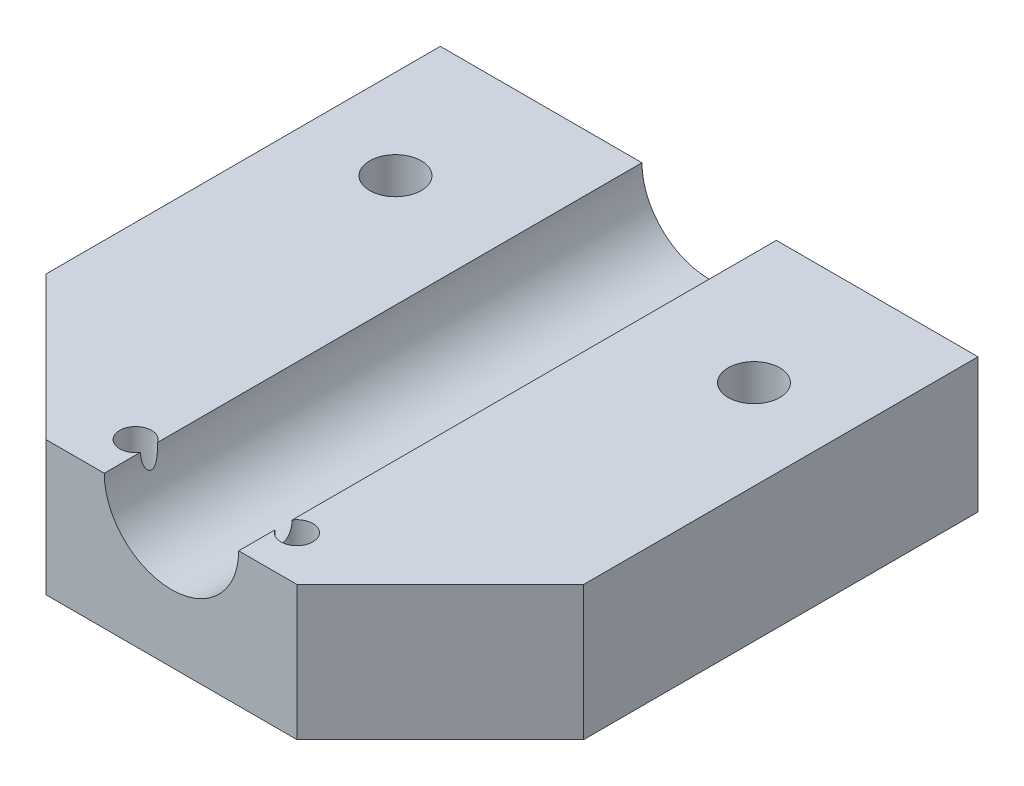
ISO-10303-21;
HEADER;
FILE_DESCRIPTION(('STEP AP214'),'2;1');
FILE_NAME('part.step','',(''),(''),'','','');
FILE_SCHEMA(('AUTOMOTIVE_DESIGN { 1 0 10303 214 1 1 1 1 }'));
ENDSEC;
DATA;
#1=APPLICATION_CONTEXT('core data for automotive mechanical design processes');
#2=APPLICATION_PROTOCOL_DEFINITION('international standard','automotive_design',2000,#1);
#3=PRODUCT_CONTEXT('',#1,'mechanical');
#4=PRODUCT('Part','Part','',(#3));
#5=PRODUCT_RELATED_PRODUCT_CATEGORY('part','',(#4));
#6=PRODUCT_DEFINITION_FORMATION('','',#4);
#7=PRODUCT_DEFINITION_CONTEXT('part definition',#1,'design');
#8=PRODUCT_DEFINITION('design','',#6,#7);
#9=PRODUCT_DEFINITION_SHAPE('','',#8);
#10=(LENGTH_UNIT() NAMED_UNIT(*) SI_UNIT(.MILLI.,.METRE.));
#11=(NAMED_UNIT(*) PLANE_ANGLE_UNIT() SI_UNIT($,.RADIAN.));
#12=(NAMED_UNIT(*) SI_UNIT($,.STERADIAN.) SOLID_ANGLE_UNIT());
#13=UNCERTAINTY_MEASURE_WITH_UNIT(LENGTH_MEASURE(1.E-05),#10,'distance_accuracy_value','');
#14=(GEOMETRIC_REPRESENTATION_CONTEXT(3) GLOBAL_UNCERTAINTY_ASSIGNED_CONTEXT((#13)) GLOBAL_UNIT_ASSIGNED_CONTEXT((#10,
#11,#12)) REPRESENTATION_CONTEXT('',''));
#15=CARTESIAN_POINT('',(0.,0.,0.));
#16=DIRECTION('',(0.,0.,1.));
#17=DIRECTION('',(1.,0.,0.));
#18=AXIS2_PLACEMENT_3D('',#15,#16,#17);
#19=CARTESIAN_POINT('',(0.,9.525,0.));
#20=DIRECTION('',(0.,-1.,0.));
#21=DIRECTION('',(0.,0.,-1.));
#22=AXIS2_PLACEMENT_3D('',#19,#20,#21);
#23=PLANE('',#22);
#24=CARTESIAN_POINT('',(12.7,9.525,-9.525));
#25=DIRECTION('',(0.,-1.,0.));
#26=DIRECTION('',(0.,0.,-1.));
#27=AXIS2_PLACEMENT_3D('',#24,#25,#26);
#28=CIRCLE('',#27,1.8288);
#29=CARTESIAN_POINT('',(12.7,9.525,-11.3538));
#30=VERTEX_POINT('',#29);
#31=EDGE_CURVE('E306',#30,#30,#28,.T.);
#32=ORIENTED_EDGE('',*,*,#31,.T.);
#33=EDGE_LOOP('',(#32));
#34=FACE_BOUND('',#33,.T.);
#35=DIRECTION('',(1.,0.,0.));
#36=VECTOR('',#35,1.);
#37=CARTESIAN_POINT('',(-19.05,9.525,19.05));
#38=LINE('',#37,#36);
#39=CARTESIAN_POINT('',(4.76250000000001,9.525,19.05));
#40=VERTEX_POINT('',#39);
#41=CARTESIAN_POINT('',(8.88999999999996,9.525,19.05));
#42=VERTEX_POINT('',#41);
#43=EDGE_CURVE('E232',#40,#42,#38,.T.);
#44=ORIENTED_EDGE('',*,*,#43,.T.);
#45=DIRECTION('',(-0.707106781186548,0.,0.707106781186547));
#46=VECTOR('',#45,1.);
#47=CARTESIAN_POINT('',(19.05,9.525,8.89));
#48=LINE('',#47,#46);
#49=CARTESIAN_POINT('',(19.05,9.525,8.89));
#50=VERTEX_POINT('',#49);
#51=EDGE_CURVE('E245',#42,#50,#48,.F.);
#52=ORIENTED_EDGE('',*,*,#51,.T.);
#53=DIRECTION('',(0.,0.,-1.));
#54=VECTOR('',#53,1.);
#55=CARTESIAN_POINT('',(19.05,9.525,19.05));
#56=LINE('',#55,#54);
#57=CARTESIAN_POINT('',(19.05,9.525,-19.05));
#58=VERTEX_POINT('',#57);
#59=EDGE_CURVE('E252',#50,#58,#56,.T.);
#60=ORIENTED_EDGE('',*,*,#59,.T.);
#61=DIRECTION('',(-1.,0.,0.));
#62=VECTOR('',#61,1.);
#63=CARTESIAN_POINT('',(-19.05,9.525,-19.05));
#64=LINE('',#63,#62);
#65=CARTESIAN_POINT('',(4.76250000000001,9.525,-19.05));
#66=VERTEX_POINT('',#65);
#67=EDGE_CURVE('E233',#58,#66,#64,.T.);
#68=ORIENTED_EDGE('',*,*,#67,.T.);
#69=DIRECTION('',(0.,0.,1.));
#70=VECTOR('',#69,1.);
#71=CARTESIAN_POINT('',(4.76250000000001,9.525,-19.05));
#72=LINE('',#71,#70);
#73=CARTESIAN_POINT('',(4.76250000000001,9.525,15.2664592536239));
#74=VERTEX_POINT('',#73);
#75=EDGE_CURVE('E125',#66,#74,#72,.T.);
#76=ORIENTED_EDGE('',*,*,#75,.T.);
#77=CARTESIAN_POINT('',(5.715,9.525,15.875));
#78=DIRECTION('',(0.,-1.,0.));
#79=DIRECTION('',(0.,0.,-1.));
#80=AXIS2_PLACEMENT_3D('',#77,#78,#79);
#81=CIRCLE('',#80,1.1303);
#82=CARTESIAN_POINT('',(4.76250000000001,9.525,16.4835407463761));
#83=VERTEX_POINT('',#82);
#84=EDGE_CURVE('E113',#74,#83,#81,.T.);
#85=ORIENTED_EDGE('',*,*,#84,.T.);
#86=EDGE_CURVE('E122',#83,#40,#72,.T.);
#87=ORIENTED_EDGE('',*,*,#86,.T.);
#88=EDGE_LOOP('',(#44,#52,#60,#68,#76,#85,#87));
#89=FACE_BOUND('',#88,.T.);
#90=ADVANCED_FACE('F35',(#34,#89),#23,.F.);
#91=CARTESIAN_POINT('',(19.05,9.525,19.05));
#92=DIRECTION('',(-1.,0.,0.));
#93=DIRECTION('',(0.,0.,1.));
#94=AXIS2_PLACEMENT_3D('',#91,#92,#93);
#95=PLANE('',#94);
#96=ORIENTED_EDGE('',*,*,#59,.F.);
#97=DIRECTION('',(0.,-1.,0.));
#98=VECTOR('',#97,1.);
#99=CARTESIAN_POINT('',(19.05,9.525,8.89));
#100=LINE('',#99,#98);
#101=CARTESIAN_POINT('',(19.05,0.,8.88999999999999));
#102=VERTEX_POINT('',#101);
#103=EDGE_CURVE('E117',#50,#102,#100,.T.);
#104=ORIENTED_EDGE('',*,*,#103,.T.);
#105=DIRECTION('',(0.,0.,-1.));
#106=VECTOR('',#105,1.);
#107=CARTESIAN_POINT('',(19.05,0.,19.05));
#108=LINE('',#107,#106);
#109=CARTESIAN_POINT('',(19.05,0.,-19.05));
#110=VERTEX_POINT('',#109);
#111=EDGE_CURVE('E271',#102,#110,#108,.T.);
#112=ORIENTED_EDGE('',*,*,#111,.T.);
#113=DIRECTION('',(0.,-1.,0.));
#114=VECTOR('',#113,1.);
#115=CARTESIAN_POINT('',(19.05,9.525,-19.05));
#116=LINE('',#115,#114);
#117=EDGE_CURVE('E260',#58,#110,#116,.T.);
#118=ORIENTED_EDGE('',*,*,#117,.F.);
#119=EDGE_LOOP('',(#96,#104,#112,#118));
#120=FACE_BOUND('',#119,.T.);
#121=ADVANCED_FACE('F201',(#120),#95,.F.);
#122=CARTESIAN_POINT('',(-19.05,9.525,-19.05));
#123=DIRECTION('',(0.,0.,1.));
#124=DIRECTION('',(1.,0.,0.));
#125=AXIS2_PLACEMENT_3D('',#122,#123,#124);
#126=PLANE('',#125);
#127=CARTESIAN_POINT('',(-4.7625,9.525,-19.05));
#128=VERTEX_POINT('',#127);
#129=CARTESIAN_POINT('',(-19.05,9.525,-19.05));
#130=VERTEX_POINT('',#129);
#131=EDGE_CURVE('E229',#128,#130,#64,.T.);
#132=ORIENTED_EDGE('',*,*,#131,.F.);
#133=CARTESIAN_POINT('',(0.,9.525,-19.05));
#134=DIRECTION('',(0.,0.,1.));
#135=DIRECTION('',(1.,0.,0.));
#136=AXIS2_PLACEMENT_3D('',#133,#134,#135);
#137=CIRCLE('',#136,4.7625);
#138=EDGE_CURVE('E282',#128,#66,#137,.T.);
#139=ORIENTED_EDGE('',*,*,#138,.T.);
#140=ORIENTED_EDGE('',*,*,#67,.F.);
#141=ORIENTED_EDGE('',*,*,#117,.T.);
#142=DIRECTION('',(-1.,0.,0.));
#143=VECTOR('',#142,1.);
#144=CARTESIAN_POINT('',(-19.05,0.,-19.05));
#145=LINE('',#144,#143);
#146=CARTESIAN_POINT('',(-19.05,0.,-19.05));
#147=VERTEX_POINT('',#146);
#148=EDGE_CURVE('E268',#110,#147,#145,.T.);
#149=ORIENTED_EDGE('',*,*,#148,.T.);
#150=DIRECTION('',(0.,-1.,0.));
#151=VECTOR('',#150,1.);
#152=CARTESIAN_POINT('',(-19.05,9.525,-19.05));
#153=LINE('',#152,#151);
#154=EDGE_CURVE('E267',#130,#147,#153,.T.);
#155=ORIENTED_EDGE('',*,*,#154,.F.);
#156=EDGE_LOOP('',(#132,#139,#140,#141,#149,#155));
#157=FACE_BOUND('',#156,.T.);
#158=ADVANCED_FACE('F207',(#157),#126,.F.);
#159=CARTESIAN_POINT('',(-19.05,9.525,19.05));
#160=DIRECTION('',(1.,0.,0.));
#161=DIRECTION('',(0.,0.,-1.));
#162=AXIS2_PLACEMENT_3D('',#159,#160,#161);
#163=PLANE('',#162);
#164=DIRECTION('',(0.,0.,1.));
#165=VECTOR('',#164,1.);
#166=CARTESIAN_POINT('',(-19.05,0.,19.05));
#167=LINE('',#166,#165);
#168=CARTESIAN_POINT('',(-19.05,0.,8.88999999999996));
#169=VERTEX_POINT('',#168);
#170=EDGE_CURVE('E266',#147,#169,#167,.T.);
#171=ORIENTED_EDGE('',*,*,#170,.T.);
#172=DIRECTION('',(0.,1.,0.));
#173=VECTOR('',#172,1.);
#174=CARTESIAN_POINT('',(-19.05,9.525,8.88999999999996));
#175=LINE('',#174,#173);
#176=CARTESIAN_POINT('',(-19.05,9.525,8.88999999999996));
#177=VERTEX_POINT('',#176);
#178=EDGE_CURVE('E43',#169,#177,#175,.T.);
#179=ORIENTED_EDGE('',*,*,#178,.T.);
#180=DIRECTION('',(0.,0.,1.));
#181=VECTOR('',#180,1.);
#182=CARTESIAN_POINT('',(-19.05,9.525,19.05));
#183=LINE('',#182,#181);
#184=EDGE_CURVE('E227',#130,#177,#183,.T.);
#185=ORIENTED_EDGE('',*,*,#184,.F.);
#186=ORIENTED_EDGE('',*,*,#154,.T.);
#187=EDGE_LOOP('',(#171,#179,#185,#186));
#188=FACE_BOUND('',#187,.T.);
#189=ADVANCED_FACE('F221',(#188),#163,.F.);
#190=CARTESIAN_POINT('',(-19.05,9.525,19.05));
#191=DIRECTION('',(0.,0.,-1.));
#192=DIRECTION('',(-1.,0.,0.));
#193=AXIS2_PLACEMENT_3D('',#190,#191,#192);
#194=PLANE('',#193);
#195=DIRECTION('',(1.,0.,0.));
#196=VECTOR('',#195,1.);
#197=CARTESIAN_POINT('',(-19.05,0.,19.05));
#198=LINE('',#197,#196);
#199=CARTESIAN_POINT('',(-8.89000000000001,0.,19.05));
#200=VERTEX_POINT('',#199);
#201=CARTESIAN_POINT('',(8.88999999999996,0.,19.05));
#202=VERTEX_POINT('',#201);
#203=EDGE_CURVE('E261',#200,#202,#198,.T.);
#204=ORIENTED_EDGE('',*,*,#203,.T.);
#205=DIRECTION('',(0.,1.,0.));
#206=VECTOR('',#205,1.);
#207=CARTESIAN_POINT('',(8.88999999999997,9.525,19.05));
#208=LINE('',#207,#206);
#209=EDGE_CURVE('E242',#202,#42,#208,.T.);
#210=ORIENTED_EDGE('',*,*,#209,.T.);
#211=ORIENTED_EDGE('',*,*,#43,.F.);
#212=CARTESIAN_POINT('',(0.,9.525,19.05));
#213=DIRECTION('',(0.,0.,1.));
#214=DIRECTION('',(1.,0.,0.));
#215=AXIS2_PLACEMENT_3D('',#212,#213,#214);
#216=CIRCLE('',#215,4.7625);
#217=CARTESIAN_POINT('',(-4.76249999999999,9.525,19.05));
#218=VERTEX_POINT('',#217);
#219=EDGE_CURVE('E132',#218,#40,#216,.T.);
#220=ORIENTED_EDGE('',*,*,#219,.F.);
#221=CARTESIAN_POINT('',(-8.89000000000001,9.525,19.05));
#222=VERTEX_POINT('',#221);
#223=EDGE_CURVE('E275',#222,#218,#38,.T.);
#224=ORIENTED_EDGE('',*,*,#223,.F.);
#225=DIRECTION('',(0.,-1.,0.));
#226=VECTOR('',#225,1.);
#227=CARTESIAN_POINT('',(-8.89000000000001,9.525,19.05));
#228=LINE('',#227,#226);
#229=EDGE_CURVE('E238',#222,#200,#228,.T.);
#230=ORIENTED_EDGE('',*,*,#229,.T.);
#231=EDGE_LOOP('',(#204,#210,#211,#220,#224,#230));
#232=FACE_BOUND('',#231,.T.);
#233=ADVANCED_FACE('F214',(#232),#194,.F.);
#234=CARTESIAN_POINT('',(-12.7,9.525,-9.525));
#235=DIRECTION('',(0.,-1.,0.));
#236=DIRECTION('',(0.,0.,-1.));
#237=AXIS2_PLACEMENT_3D('',#234,#235,#236);
#238=CIRCLE('',#237,1.8288);
#239=CARTESIAN_POINT('',(-12.7,9.525,-11.3538));
#240=VERTEX_POINT('',#239);
#241=EDGE_CURVE('E226',#240,#240,#238,.T.);
#242=ORIENTED_EDGE('',*,*,#241,.T.);
#243=EDGE_LOOP('',(#242));
#244=FACE_BOUND('',#243,.T.);
#245=ORIENTED_EDGE('',*,*,#184,.T.);
#246=DIRECTION('',(-0.707106781186546,0.,-0.707106781186549));
#247=VECTOR('',#246,1.);
#248=CARTESIAN_POINT('',(-8.89000000000001,9.525,19.05));
#249=LINE('',#248,#247);
#250=EDGE_CURVE('E11',#177,#222,#249,.F.);
#251=ORIENTED_EDGE('',*,*,#250,.T.);
#252=ORIENTED_EDGE('',*,*,#223,.T.);
#253=DIRECTION('',(0.,0.,1.));
#254=VECTOR('',#253,1.);
#255=CARTESIAN_POINT('',(-4.76249999999999,9.525,-19.05));
#256=LINE('',#255,#254);
#257=CARTESIAN_POINT('',(-4.76249999999999,9.525,16.4835407463761));
#258=VERTEX_POINT('',#257);
#259=EDGE_CURVE('E134',#218,#258,#256,.F.);
#260=ORIENTED_EDGE('',*,*,#259,.T.);
#261=CARTESIAN_POINT('',(-5.715,9.525,15.875));
#262=DIRECTION('',(0.,-1.,0.));
#263=DIRECTION('',(0.,0.,-1.));
#264=AXIS2_PLACEMENT_3D('',#261,#262,#263);
#265=CIRCLE('',#264,1.1303);
#266=CARTESIAN_POINT('',(-4.76249999999999,9.525,15.2664592536239));
#267=VERTEX_POINT('',#266);
#268=EDGE_CURVE('E280',#258,#267,#265,.T.);
#269=ORIENTED_EDGE('',*,*,#268,.T.);
#270=EDGE_CURVE('E137',#267,#128,#256,.F.);
#271=ORIENTED_EDGE('',*,*,#270,.T.);
#272=ORIENTED_EDGE('',*,*,#131,.T.);
#273=EDGE_LOOP('',(#245,#251,#252,#260,#269,#271,#272));
#274=FACE_BOUND('',#273,.T.);
#275=ADVANCED_FACE('F203',(#244,#274),#23,.F.);
#276=CARTESIAN_POINT('',(0.,0.,0.));
#277=DIRECTION('',(0.,-1.,0.));
#278=DIRECTION('',(0.,0.,-1.));
#279=AXIS2_PLACEMENT_3D('',#276,#277,#278);
#280=PLANE('',#279);
#281=CARTESIAN_POINT('',(12.7,0.,-9.525));
#282=DIRECTION('',(0.,-1.,0.));
#283=DIRECTION('',(0.,0.,-1.));
#284=AXIS2_PLACEMENT_3D('',#281,#282,#283);
#285=CIRCLE('',#284,4.20751);
#286=CARTESIAN_POINT('',(12.7,0.,-13.73251));
#287=VERTEX_POINT('',#286);
#288=EDGE_CURVE('E317',#287,#287,#285,.T.);
#289=ORIENTED_EDGE('',*,*,#288,.F.);
#290=EDGE_LOOP('',(#289));
#291=FACE_BOUND('',#290,.T.);
#292=CARTESIAN_POINT('',(-12.7,0.,-9.525));
#293=DIRECTION('',(0.,-1.,0.));
#294=DIRECTION('',(0.,0.,-1.));
#295=AXIS2_PLACEMENT_3D('',#292,#293,#294);
#296=CIRCLE('',#295,4.20751);
#297=CARTESIAN_POINT('',(-12.7,0.,-13.73251));
#298=VERTEX_POINT('',#297);
#299=EDGE_CURVE('E303',#298,#298,#296,.T.);
#300=ORIENTED_EDGE('',*,*,#299,.F.);
#301=EDGE_LOOP('',(#300));
#302=FACE_BOUND('',#301,.T.);
#303=CARTESIAN_POINT('',(5.715,0.,15.875));
#304=DIRECTION('',(0.,-1.,0.));
#305=DIRECTION('',(0.,0.,-1.));
#306=AXIS2_PLACEMENT_3D('',#303,#304,#305);
#307=CIRCLE('',#306,1.13029999999999);
#308=CARTESIAN_POINT('',(5.715,0.,14.7447));
#309=VERTEX_POINT('',#308);
#310=EDGE_CURVE('E127',#309,#309,#307,.T.);
#311=ORIENTED_EDGE('',*,*,#310,.F.);
#312=EDGE_LOOP('',(#311));
#313=FACE_BOUND('',#312,.T.);
#314=CARTESIAN_POINT('',(-5.715,0.,15.875));
#315=DIRECTION('',(0.,-1.,0.));
#316=DIRECTION('',(0.,0.,-1.));
#317=AXIS2_PLACEMENT_3D('',#314,#315,#316);
#318=CIRCLE('',#317,1.13029999999999);
#319=CARTESIAN_POINT('',(-5.715,0.,14.7447));
#320=VERTEX_POINT('',#319);
#321=EDGE_CURVE('E126',#320,#320,#318,.T.);
#322=ORIENTED_EDGE('',*,*,#321,.F.);
#323=EDGE_LOOP('',(#322));
#324=FACE_BOUND('',#323,.T.);
#325=ORIENTED_EDGE('',*,*,#111,.F.);
#326=DIRECTION('',(0.707106781186548,0.,-0.707106781186547));
#327=VECTOR('',#326,1.);
#328=CARTESIAN_POINT('',(13.97,0.,13.97));
#329=LINE('',#328,#327);
#330=EDGE_CURVE('E243',#102,#202,#329,.F.);
#331=ORIENTED_EDGE('',*,*,#330,.T.);
#332=ORIENTED_EDGE('',*,*,#203,.F.);
#333=DIRECTION('',(0.707106781186546,0.,0.707106781186549));
#334=VECTOR('',#333,1.);
#335=CARTESIAN_POINT('',(-13.97,0.,13.97));
#336=LINE('',#335,#334);
#337=EDGE_CURVE('E239',#200,#169,#336,.F.);
#338=ORIENTED_EDGE('',*,*,#337,.T.);
#339=ORIENTED_EDGE('',*,*,#170,.F.);
#340=ORIENTED_EDGE('',*,*,#148,.F.);
#341=EDGE_LOOP('',(#325,#331,#332,#338,#339,#340));
#342=FACE_BOUND('',#341,.T.);
#343=ADVANCED_FACE('F213',(#291,#302,#313,#324,#342),#280,.T.);
#344=CARTESIAN_POINT('',(0.,9.525,-19.05));
#345=DIRECTION('',(0.,0.,1.));
#346=DIRECTION('',(1.,0.,0.));
#347=AXIS2_PLACEMENT_3D('',#344,#345,#346);
#348=CYLINDRICAL_SURFACE('',#347,4.7625);
#349=ORIENTED_EDGE('',*,*,#86,.F.);
#350=CARTESIAN_POINT('',(4.76250000000001,9.525,16.4835407463761));
#351=CARTESIAN_POINT('',(4.76251001544345,9.45992041238871,16.4834840419758));
#352=CARTESIAN_POINT('',(4.76116617016807,9.39481924499658,16.4814487061772));
#353=CARTESIAN_POINT('',(4.75582590491911,9.26468529632301,16.473006888764));
#354=CARTESIAN_POINT('',(4.7518161832753,9.19965450428404,16.4665784829591));
#355=CARTESIAN_POINT('',(4.74094016461343,9.0672668073966,16.4484963020676));
#356=CARTESIAN_POINT('',(4.73394339283061,8.99995227555494,16.4366016761593));
#357=CARTESIAN_POINT('',(4.7173270873151,8.86720734835677,16.4065322695432));
#358=CARTESIAN_POINT('',(4.70771388734485,8.80177281949058,16.3883726269344));
#359=CARTESIAN_POINT('',(4.68737166822794,8.68041347986056,16.3462288238067));
#360=CARTESIAN_POINT('',(4.67685475959289,8.62419733098139,16.3230223704103));
#361=CARTESIAN_POINT('',(4.66037166319798,8.54362762251188,16.2818740036224));
#362=CARTESIAN_POINT('',(4.65479155414327,8.51752867266713,16.2671980626801));
#363=CARTESIAN_POINT('',(4.64354991723204,8.46692759859648,16.235360423373));
#364=CARTESIAN_POINT('',(4.63788850770957,8.44242339396053,16.2182020616518));
#365=CARTESIAN_POINT('',(4.62788196975832,8.40050922918945,16.1848213119263));
#366=CARTESIAN_POINT('',(4.62350668382875,8.38267993103742,16.1691387558864));
#367=CARTESIAN_POINT('',(4.61503755684555,8.34893155127719,16.1356891646817));
#368=CARTESIAN_POINT('',(4.6109441290188,8.3330152498378,16.1179191681985));
#369=CARTESIAN_POINT('',(4.60326411948495,8.30369003496732,16.0799416628677));
#370=CARTESIAN_POINT('',(4.59968389433691,8.29031199675167,16.0597085183901));
#371=CARTESIAN_POINT('',(4.59345813757747,8.2673468202547,16.017061757638));
#372=CARTESIAN_POINT('',(4.59081008280196,8.25774944010326,15.9946542401754));
#373=CARTESIAN_POINT('',(4.58738100545469,8.24540203887657,15.9546186700033));
#374=CARTESIAN_POINT('',(4.58628659033486,8.24149396349521,15.937374855766));
#375=CARTESIAN_POINT('',(4.58489869989573,8.2365446486566,15.9024497985964));
#376=CARTESIAN_POINT('',(4.58460462186362,8.23550125188005,15.8847688949562));
#377=CARTESIAN_POINT('',(4.58485025703122,8.23637496835113,15.8494794172976));
#378=CARTESIAN_POINT('',(4.58539037977055,8.23829353573497,15.831870883064));
#379=CARTESIAN_POINT('',(4.58724487838323,8.24492103763739,15.7972292253676));
#380=CARTESIAN_POINT('',(4.58855986852565,8.24963218596673,15.7801965697671));
#381=CARTESIAN_POINT('',(4.59227698873494,8.26307359392576,15.742653149641));
#382=CARTESIAN_POINT('',(4.59487560592023,8.27254096688579,15.7224274618889));
#383=CARTESIAN_POINT('',(4.6008108805876,8.29452225524255,15.6838350072045));
#384=CARTESIAN_POINT('',(4.60414885858677,8.30704162565991,15.6654716530911));
#385=CARTESIAN_POINT('',(4.61314251220421,8.34145578699138,15.6215810358855));
#386=CARTESIAN_POINT('',(4.6191008150707,8.36484060219711,15.5972938489869));
#387=CARTESIAN_POINT('',(4.63140124545435,8.41495309227191,15.5526219181303));
#388=CARTESIAN_POINT('',(4.63774420199371,8.44168813011673,15.5322460279768));
#389=CARTESIAN_POINT('',(4.65548823630479,8.51978113135394,15.4796443715965));
#390=CARTESIAN_POINT('',(4.66684426479985,8.57361254529948,15.4511097266783));
#391=CARTESIAN_POINT('',(4.68820882105334,8.6851288640969,15.4017239065086));
#392=CARTESIAN_POINT('',(4.69820838115995,8.74283596830147,15.3809224189831));
#393=CARTESIAN_POINT('',(4.71627265743655,8.86038423778715,15.3453609827791));
#394=CARTESIAN_POINT('',(4.72433614397748,8.92022673172293,15.3306048694282));
#395=CARTESIAN_POINT('',(4.73825860513123,9.04123036900287,15.3060088864004));
#396=CARTESIAN_POINT('',(4.74411419898259,9.10239338418148,15.2961765485974));
#397=CARTESIAN_POINT('',(4.75334168781531,9.22375602871859,15.2809698887985));
#398=CARTESIAN_POINT('',(4.75677641221364,9.28393704032384,15.2754822988023));
#399=CARTESIAN_POINT('',(4.76135564921565,9.40441813849827,15.2682534439532));
#400=CARTESIAN_POINT('',(4.76250751301419,9.46471721491022,15.2665001526642));
#401=CARTESIAN_POINT('',(4.76250000000001,9.525,15.2664592536239));
#402=B_SPLINE_CURVE_WITH_KNOTS('',3,(#350,#351,#352,#353,#354,#355,#356,#357,#358,#359,#360,
#361,#362,#363,#364,#365,#366,#367,#368,#369,#370,#371,#372,#373,#374,#375,#376,#377,#378,#379,
#380,#381,#382,#383,#384,#385,#386,#387,#388,#389,#390,#391,#392,#393,#394,#395,#396,#397,#398,
#399,#400,#401),.UNSPECIFIED.,.F.,.F.,(4,2,2,2,2,2,2,2,2,2,2,2,2,2,2,2,2,2,2,2,2,2,2,2,2,4),(0.,
0.195227280753085,0.391436053170546,0.597269402912983,0.802608843093855,0.987118564799798,
1.07838654574141,1.16953297304749,1.24183634599886,1.31424355883691,1.38748182463672,
1.46052029931836,1.51343431127595,1.56630846404267,1.61920858291487,1.6721506943995,
1.7392235499031,1.80641717926305,1.90855069584889,2.01091274883025,2.19580400898978,
2.38186351656457,2.56804088255587,2.75450217973179,2.93592572904447,3.11676410861203),.UNSPECIFIED.);
#403=EDGE_CURVE('E110',#83,#74,#402,.T.);
#404=ORIENTED_EDGE('',*,*,#403,.T.);
#405=ORIENTED_EDGE('',*,*,#75,.F.);
#406=ORIENTED_EDGE('',*,*,#138,.F.);
#407=ORIENTED_EDGE('',*,*,#270,.F.);
#408=CARTESIAN_POINT('',(-4.76249999999999,9.525,15.2664592536239));
#409=CARTESIAN_POINT('',(-4.76251001544343,9.45992041238871,15.2665159580242));
#410=CARTESIAN_POINT('',(-4.76116617016805,9.39481924499659,15.2685512938228));
#411=CARTESIAN_POINT('',(-4.7558259049191,9.26468529632303,15.276993111236));
#412=CARTESIAN_POINT('',(-4.75181618327529,9.19965450428406,15.2834215170409));
#413=CARTESIAN_POINT('',(-4.74094016461342,9.06726680739662,15.3015036979324));
#414=CARTESIAN_POINT('',(-4.7339433928306,8.99995227555497,15.3133983238407));
#415=CARTESIAN_POINT('',(-4.71732708731509,8.8672073483568,15.3434677304568));
#416=CARTESIAN_POINT('',(-4.70771388734484,8.80177281949062,15.3616273730656));
#417=CARTESIAN_POINT('',(-4.68737166822793,8.68041347986061,15.4037711761934));
#418=CARTESIAN_POINT('',(-4.67685475959289,8.62419733098144,15.4269776295897));
#419=CARTESIAN_POINT('',(-4.66037166319798,8.54362762251194,15.4681259963777));
#420=CARTESIAN_POINT('',(-4.65479155414327,8.51752867266719,15.4828019373199));
#421=CARTESIAN_POINT('',(-4.64354991723204,8.46692759859654,15.514639576627));
#422=CARTESIAN_POINT('',(-4.63788850770957,8.44242339396058,15.5317979383482));
#423=CARTESIAN_POINT('',(-4.62788196975832,8.40050922918951,15.5651786880737));
#424=CARTESIAN_POINT('',(-4.62350668382875,8.38267993103748,15.5808612441136));
#425=CARTESIAN_POINT('',(-4.61503755684555,8.34893155127725,15.6143108353183));
#426=CARTESIAN_POINT('',(-4.6109441290188,8.33301524983786,15.6320808318015));
#427=CARTESIAN_POINT('',(-4.60326411948495,8.30369003496739,15.6700583371323));
#428=CARTESIAN_POINT('',(-4.59968389433691,8.29031199675173,15.6902914816099));
#429=CARTESIAN_POINT('',(-4.59345813757748,8.26734682025477,15.732938242362));
#430=CARTESIAN_POINT('',(-4.59081008280197,8.25774944010332,15.7553457598246));
#431=CARTESIAN_POINT('',(-4.58738100545469,8.24540203887663,15.7953813299967));
#432=CARTESIAN_POINT('',(-4.58628659033486,8.24149396349527,15.812625144234));
#433=CARTESIAN_POINT('',(-4.58489869989573,8.23654464865666,15.8475502014036));
#434=CARTESIAN_POINT('',(-4.58460462186362,8.23550125188011,15.8652311050438));
#435=CARTESIAN_POINT('',(-4.58485025703122,8.23637496835119,15.9005205827023));
#436=CARTESIAN_POINT('',(-4.58539037977056,8.23829353573503,15.918129116936));
#437=CARTESIAN_POINT('',(-4.58724487838324,8.24492103763745,15.9527707746324));
#438=CARTESIAN_POINT('',(-4.58855986852565,8.24963218596679,15.9698034302329));
#439=CARTESIAN_POINT('',(-4.59227698873494,8.26307359392581,16.0073468503589));
#440=CARTESIAN_POINT('',(-4.59487560592024,8.27254096688584,16.0275725381111));
#441=CARTESIAN_POINT('',(-4.6008108805876,8.2945222552426,16.0661649927955));
#442=CARTESIAN_POINT('',(-4.60414885858677,8.30704162565996,16.0845283469088));
#443=CARTESIAN_POINT('',(-4.61314251220421,8.34145578699143,16.1284189641145));
#444=CARTESIAN_POINT('',(-4.6191008150707,8.36484060219716,16.1527061510131));
#445=CARTESIAN_POINT('',(-4.63140124545434,8.41495309227195,16.1973780818696));
#446=CARTESIAN_POINT('',(-4.6377442019937,8.44168813011678,16.2177539720231));
#447=CARTESIAN_POINT('',(-4.65548823630478,8.51978113135398,16.2703556284034));
#448=CARTESIAN_POINT('',(-4.66684426479984,8.57361254529951,16.2988902733217));
#449=CARTESIAN_POINT('',(-4.68820882105333,8.68512886409692,16.3482760934914));
#450=CARTESIAN_POINT('',(-4.69820838115994,8.74283596830148,16.3690775810169));
#451=CARTESIAN_POINT('',(-4.71627265743654,8.86038423778716,16.4046390172209));
#452=CARTESIAN_POINT('',(-4.72433614397747,8.92022673172294,16.4193951305718));
#453=CARTESIAN_POINT('',(-4.73825860513122,9.04123036900287,16.4439911135996));
#454=CARTESIAN_POINT('',(-4.74411419898258,9.10239338418148,16.4538234514025));
#455=CARTESIAN_POINT('',(-4.7533416878153,9.2237560287186,16.4690301112015));
#456=CARTESIAN_POINT('',(-4.75677641221363,9.28393704032385,16.4745177011976));
#457=CARTESIAN_POINT('',(-4.76135564921564,9.40441813849827,16.4817465560467));
#458=CARTESIAN_POINT('',(-4.76250751301418,9.46471721491022,16.4834998473358));
#459=CARTESIAN_POINT('',(-4.76249999999999,9.525,16.4835407463761));
#460=B_SPLINE_CURVE_WITH_KNOTS('',3,(#408,#409,#410,#411,#412,#413,#414,#415,#416,#417,#418,
#419,#420,#421,#422,#423,#424,#425,#426,#427,#428,#429,#430,#431,#432,#433,#434,#435,#436,#437,
#438,#439,#440,#441,#442,#443,#444,#445,#446,#447,#448,#449,#450,#451,#452,#453,#454,#455,#456,
#457,#458,#459),.UNSPECIFIED.,.F.,.F.,(4,2,2,2,2,2,2,2,2,2,2,2,2,2,2,2,2,2,2,2,2,2,2,2,2,4),(0.,
0.195227280753073,0.391436053170523,0.597269402912949,0.802608843093809,0.987118564799742,
1.07838654574135,1.16953297304742,1.2418363459988,1.31424355883684,1.38748182463664,
1.46052029931829,1.51343431127587,1.56630846404259,1.61920858291478,1.67215069439941,
1.739223549903,1.80641717926296,1.90855069584879,2.01091274883014,2.19580400898965,
2.38186351656443,2.56804088255572,2.75450217973164,2.93592572904432,3.11676410861188),.UNSPECIFIED.);
#461=EDGE_CURVE('E118',#267,#258,#460,.T.);
#462=ORIENTED_EDGE('',*,*,#461,.T.);
#463=ORIENTED_EDGE('',*,*,#259,.F.);
#464=ORIENTED_EDGE('',*,*,#219,.T.);
#465=EDGE_LOOP('',(#349,#404,#405,#406,#407,#462,#463,#464));
#466=FACE_BOUND('',#465,.T.);
#467=ADVANCED_FACE('F129',(#466),#348,.F.);
#468=CARTESIAN_POINT('',(-5.715,0.,15.875));
#469=DIRECTION('',(0.,-1.,0.));
#470=DIRECTION('',(0.,0.,-1.));
#471=AXIS2_PLACEMENT_3D('',#468,#469,#470);
#472=CYLINDRICAL_SURFACE('',#471,1.13029999999999);
#473=ORIENTED_EDGE('',*,*,#321,.T.);
#474=EDGE_LOOP('',(#473));
#475=FACE_BOUND('',#474,.T.);
#476=ORIENTED_EDGE('',*,*,#268,.F.);
#477=ORIENTED_EDGE('',*,*,#461,.F.);
#478=EDGE_LOOP('',(#476,#477));
#479=FACE_BOUND('',#478,.T.);
#480=ADVANCED_FACE('F154',(#475,#479),#472,.F.);
#481=CARTESIAN_POINT('',(5.715,0.,15.875));
#482=DIRECTION('',(0.,-1.,0.));
#483=DIRECTION('',(0.,0.,-1.));
#484=AXIS2_PLACEMENT_3D('',#481,#482,#483);
#485=CYLINDRICAL_SURFACE('',#484,1.13029999999999);
#486=ORIENTED_EDGE('',*,*,#310,.T.);
#487=EDGE_LOOP('',(#486));
#488=FACE_BOUND('',#487,.T.);
#489=ORIENTED_EDGE('',*,*,#84,.F.);
#490=ORIENTED_EDGE('',*,*,#403,.F.);
#491=EDGE_LOOP('',(#489,#490));
#492=FACE_BOUND('',#491,.T.);
#493=ADVANCED_FACE('F112',(#488,#492),#485,.F.);
#494=CARTESIAN_POINT('',(-12.7,0.,-9.525));
#495=DIRECTION('',(0.,-1.,0.));
#496=DIRECTION('',(0.,0.,-1.));
#497=AXIS2_PLACEMENT_3D('',#494,#495,#496);
#498=CYLINDRICAL_SURFACE('',#497,1.8288);
#499=ORIENTED_EDGE('',*,*,#241,.F.);
#500=EDGE_LOOP('',(#499));
#501=FACE_BOUND('',#500,.T.);
#502=CARTESIAN_POINT('',(-12.7,3.5052,-9.525));
#503=DIRECTION('',(0.,-1.,0.));
#504=DIRECTION('',(0.,0.,-1.));
#505=AXIS2_PLACEMENT_3D('',#502,#503,#504);
#506=CIRCLE('',#505,1.8288);
#507=CARTESIAN_POINT('',(-12.7,3.5052,-11.3538));
#508=VERTEX_POINT('',#507);
#509=EDGE_CURVE('E294',#508,#508,#506,.T.);
#510=ORIENTED_EDGE('',*,*,#509,.T.);
#511=EDGE_LOOP('',(#510));
#512=FACE_BOUND('',#511,.T.);
#513=ADVANCED_FACE('F161',(#501,#512),#498,.F.);
#514=CARTESIAN_POINT('',(-9.12749,3.5052,-9.525));
#515=DIRECTION('',(0.,1.,0.));
#516=DIRECTION('',(0.,0.,1.));
#517=AXIS2_PLACEMENT_3D('',#514,#515,#516);
#518=PLANE('',#517);
#519=ORIENTED_EDGE('',*,*,#509,.F.);
#520=EDGE_LOOP('',(#519));
#521=FACE_BOUND('',#520,.T.);
#522=CARTESIAN_POINT('',(-12.7,3.5052,-9.525));
#523=DIRECTION('',(0.,-1.,0.));
#524=DIRECTION('',(0.,0.,-1.));
#525=AXIS2_PLACEMENT_3D('',#522,#523,#524);
#526=CIRCLE('',#525,3.57251);
#527=CARTESIAN_POINT('',(-12.7,3.5052,-13.09751));
#528=VERTEX_POINT('',#527);
#529=EDGE_CURVE('E297',#528,#528,#526,.T.);
#530=ORIENTED_EDGE('',*,*,#529,.T.);
#531=EDGE_LOOP('',(#530));
#532=FACE_BOUND('',#531,.T.);
#533=ADVANCED_FACE('F165',(#521,#532),#518,.F.);
#534=CARTESIAN_POINT('',(-12.7,0.,-9.525));
#535=DIRECTION('',(0.,-1.,0.));
#536=DIRECTION('',(0.,0.,-1.));
#537=AXIS2_PLACEMENT_3D('',#534,#535,#536);
#538=CYLINDRICAL_SURFACE('',#537,3.57251);
#539=ORIENTED_EDGE('',*,*,#529,.F.);
#540=EDGE_LOOP('',(#539));
#541=FACE_BOUND('',#540,.T.);
#542=CARTESIAN_POINT('',(-12.7,0.634999999999999,-9.525));
#543=DIRECTION('',(0.,-1.,0.));
#544=DIRECTION('',(0.,0.,-1.));
#545=AXIS2_PLACEMENT_3D('',#542,#543,#544);
#546=CIRCLE('',#545,3.57251);
#547=CARTESIAN_POINT('',(-12.7,0.634999999999999,-13.09751));
#548=VERTEX_POINT('',#547);
#549=EDGE_CURVE('E300',#548,#548,#546,.T.);
#550=ORIENTED_EDGE('',*,*,#549,.T.);
#551=EDGE_LOOP('',(#550));
#552=FACE_BOUND('',#551,.T.);
#553=ADVANCED_FACE('F169',(#541,#552),#538,.F.);
#554=CARTESIAN_POINT('',(-12.7,0.,-9.525));
#555=DIRECTION('',(0.,-1.,0.));
#556=DIRECTION('',(0.,0.,-1.));
#557=AXIS2_PLACEMENT_3D('',#554,#555,#556);
#558=CONICAL_SURFACE('',#557,4.20751,0.785398163397449);
#559=ORIENTED_EDGE('',*,*,#549,.F.);
#560=EDGE_LOOP('',(#559));
#561=FACE_BOUND('',#560,.T.);
#562=ORIENTED_EDGE('',*,*,#299,.T.);
#563=EDGE_LOOP('',(#562));
#564=FACE_BOUND('',#563,.T.);
#565=ADVANCED_FACE('F173',(#561,#564),#558,.F.);
#566=CARTESIAN_POINT('',(12.7,0.,-9.525));
#567=DIRECTION('',(0.,-1.,0.));
#568=DIRECTION('',(0.,0.,-1.));
#569=AXIS2_PLACEMENT_3D('',#566,#567,#568);
#570=CYLINDRICAL_SURFACE('',#569,1.8288);
#571=ORIENTED_EDGE('',*,*,#31,.F.);
#572=EDGE_LOOP('',(#571));
#573=FACE_BOUND('',#572,.T.);
#574=CARTESIAN_POINT('',(12.7,3.5052,-9.525));
#575=DIRECTION('',(0.,-1.,0.));
#576=DIRECTION('',(0.,0.,-1.));
#577=AXIS2_PLACEMENT_3D('',#574,#575,#576);
#578=CIRCLE('',#577,1.8288);
#579=CARTESIAN_POINT('',(12.7,3.5052,-11.3538));
#580=VERTEX_POINT('',#579);
#581=EDGE_CURVE('E308',#580,#580,#578,.T.);
#582=ORIENTED_EDGE('',*,*,#581,.T.);
#583=EDGE_LOOP('',(#582));
#584=FACE_BOUND('',#583,.T.);
#585=ADVANCED_FACE('F177',(#573,#584),#570,.F.);
#586=CARTESIAN_POINT('',(16.27251,3.5052,-9.525));
#587=DIRECTION('',(0.,1.,0.));
#588=DIRECTION('',(0.,0.,1.));
#589=AXIS2_PLACEMENT_3D('',#586,#587,#588);
#590=PLANE('',#589);
#591=ORIENTED_EDGE('',*,*,#581,.F.);
#592=EDGE_LOOP('',(#591));
#593=FACE_BOUND('',#592,.T.);
#594=CARTESIAN_POINT('',(12.7,3.5052,-9.525));
#595=DIRECTION('',(0.,-1.,0.));
#596=DIRECTION('',(0.,0.,-1.));
#597=AXIS2_PLACEMENT_3D('',#594,#595,#596);
#598=CIRCLE('',#597,3.57251);
#599=CARTESIAN_POINT('',(12.7,3.5052,-13.09751));
#600=VERTEX_POINT('',#599);
#601=EDGE_CURVE('E311',#600,#600,#598,.T.);
#602=ORIENTED_EDGE('',*,*,#601,.T.);
#603=EDGE_LOOP('',(#602));
#604=FACE_BOUND('',#603,.T.);
#605=ADVANCED_FACE('F181',(#593,#604),#590,.F.);
#606=CARTESIAN_POINT('',(12.7,0.,-9.525));
#607=DIRECTION('',(0.,-1.,0.));
#608=DIRECTION('',(0.,0.,-1.));
#609=AXIS2_PLACEMENT_3D('',#606,#607,#608);
#610=CYLINDRICAL_SURFACE('',#609,3.57251);
#611=ORIENTED_EDGE('',*,*,#601,.F.);
#612=EDGE_LOOP('',(#611));
#613=FACE_BOUND('',#612,.T.);
#614=CARTESIAN_POINT('',(12.7,0.634999999999999,-9.525));
#615=DIRECTION('',(0.,-1.,0.));
#616=DIRECTION('',(0.,0.,-1.));
#617=AXIS2_PLACEMENT_3D('',#614,#615,#616);
#618=CIRCLE('',#617,3.57251);
#619=CARTESIAN_POINT('',(12.7,0.634999999999999,-13.09751));
#620=VERTEX_POINT('',#619);
#621=EDGE_CURVE('E314',#620,#620,#618,.T.);
#622=ORIENTED_EDGE('',*,*,#621,.T.);
#623=EDGE_LOOP('',(#622));
#624=FACE_BOUND('',#623,.T.);
#625=ADVANCED_FACE('F185',(#613,#624),#610,.F.);
#626=CARTESIAN_POINT('',(12.7,0.,-9.525));
#627=DIRECTION('',(0.,-1.,0.));
#628=DIRECTION('',(0.,0.,-1.));
#629=AXIS2_PLACEMENT_3D('',#626,#627,#628);
#630=CONICAL_SURFACE('',#629,4.20751,0.785398163397449);
#631=ORIENTED_EDGE('',*,*,#621,.F.);
#632=EDGE_LOOP('',(#631));
#633=FACE_BOUND('',#632,.T.);
#634=ORIENTED_EDGE('',*,*,#288,.T.);
#635=EDGE_LOOP('',(#634));
#636=FACE_BOUND('',#635,.T.);
#637=ADVANCED_FACE('F189',(#633,#636),#630,.F.);
#638=CARTESIAN_POINT('',(19.05,9.525,8.89));
#639=DIRECTION('',(-0.707106781186547,0.,-0.707106781186548));
#640=DIRECTION('',(0.,-1.,0.));
#641=AXIS2_PLACEMENT_3D('',#638,#639,#640);
#642=PLANE('',#641);
#643=ORIENTED_EDGE('',*,*,#51,.F.);
#644=ORIENTED_EDGE('',*,*,#209,.F.);
#645=ORIENTED_EDGE('',*,*,#330,.F.);
#646=ORIENTED_EDGE('',*,*,#103,.F.);
#647=EDGE_LOOP('',(#643,#644,#645,#646));
#648=FACE_BOUND('',#647,.T.);
#649=ADVANCED_FACE('F192',(#648),#642,.F.);
#650=CARTESIAN_POINT('',(-8.89000000000001,9.525,19.05));
#651=DIRECTION('',(0.707106781186549,0.,-0.707106781186546));
#652=DIRECTION('',(0.,-1.,0.));
#653=AXIS2_PLACEMENT_3D('',#650,#651,#652);
#654=PLANE('',#653);
#655=ORIENTED_EDGE('',*,*,#250,.F.);
#656=ORIENTED_EDGE('',*,*,#178,.F.);
#657=ORIENTED_EDGE('',*,*,#337,.F.);
#658=ORIENTED_EDGE('',*,*,#229,.F.);
#659=EDGE_LOOP('',(#655,#656,#657,#658));
#660=FACE_BOUND('',#659,.T.);
#661=ADVANCED_FACE('F37',(#660),#654,.F.);
#662=CLOSED_SHELL('',(#90,#121,#158,#189,#233,#275,#343,#467,#480,#493,#513,#533,#553,#565,#585,
#605,#625,#637,#649,#661));
#663=MANIFOLD_SOLID_BREP('B2',#662);
#664=ADVANCED_BREP_SHAPE_REPRESENTATION('',(#18,#663),#14);
#665=SHAPE_DEFINITION_REPRESENTATION(#9,#664);
ENDSEC;
END-ISO-10303-21;
